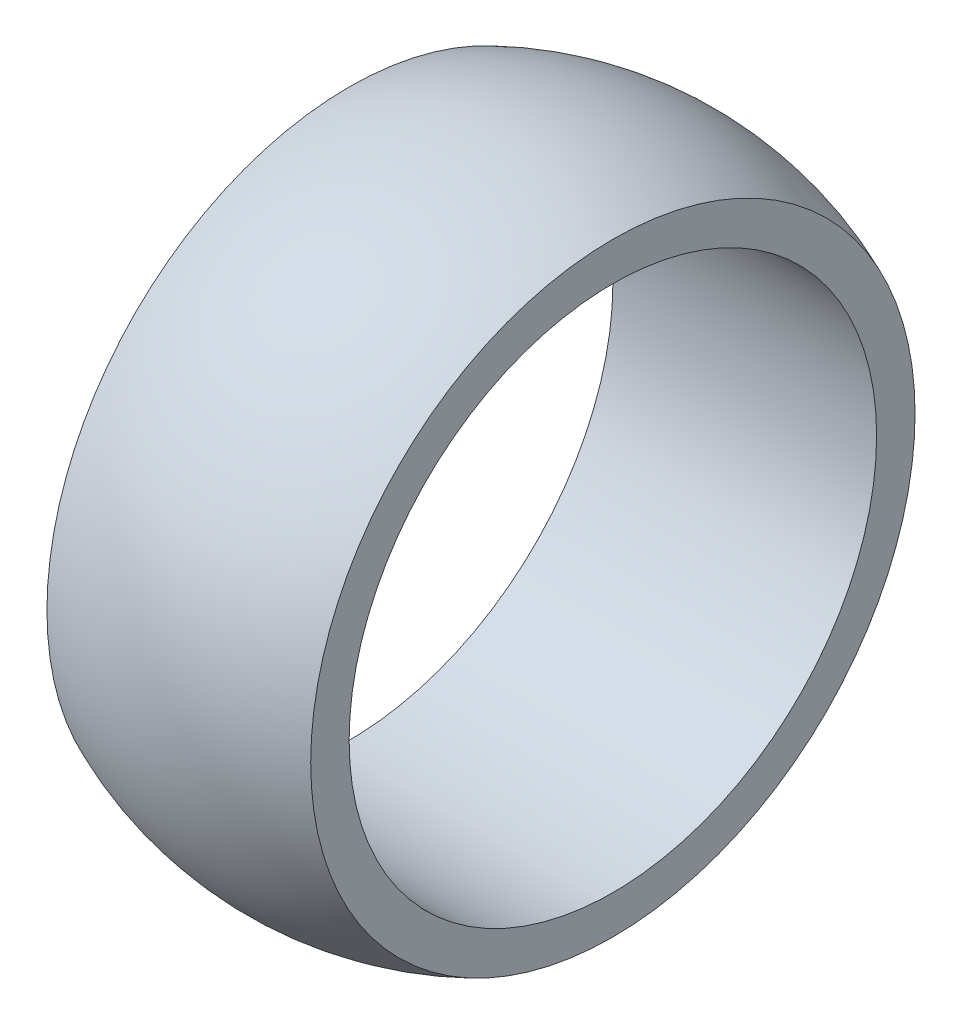
ISO-10303-21;
HEADER;
FILE_DESCRIPTION(('STEP AP214'),'2;1');
FILE_NAME('part.step','',(''),(''),'','','');
FILE_SCHEMA(('AUTOMOTIVE_DESIGN { 1 0 10303 214 1 1 1 1 }'));
ENDSEC;
DATA;
#1=APPLICATION_CONTEXT('core data for automotive mechanical design processes');
#2=APPLICATION_PROTOCOL_DEFINITION('international standard','automotive_design',2000,#1);
#3=PRODUCT_CONTEXT('',#1,'mechanical');
#4=PRODUCT('Part','Part','',(#3));
#5=PRODUCT_RELATED_PRODUCT_CATEGORY('part','',(#4));
#6=PRODUCT_DEFINITION_FORMATION('','',#4);
#7=PRODUCT_DEFINITION_CONTEXT('part definition',#1,'design');
#8=PRODUCT_DEFINITION('design','',#6,#7);
#9=PRODUCT_DEFINITION_SHAPE('','',#8);
#10=(LENGTH_UNIT() NAMED_UNIT(*) SI_UNIT(.MILLI.,.METRE.));
#11=(NAMED_UNIT(*) PLANE_ANGLE_UNIT() SI_UNIT($,.RADIAN.));
#12=(NAMED_UNIT(*) SI_UNIT($,.STERADIAN.) SOLID_ANGLE_UNIT());
#13=UNCERTAINTY_MEASURE_WITH_UNIT(LENGTH_MEASURE(1.E-05),#10,'distance_accuracy_value','');
#14=(GEOMETRIC_REPRESENTATION_CONTEXT(3) GLOBAL_UNCERTAINTY_ASSIGNED_CONTEXT((#13)) GLOBAL_UNIT_ASSIGNED_CONTEXT((#10,
#11,#12)) REPRESENTATION_CONTEXT('',''));
#15=CARTESIAN_POINT('',(0.,0.,0.));
#16=DIRECTION('',(0.,0.,1.));
#17=DIRECTION('',(1.,0.,0.));
#18=AXIS2_PLACEMENT_3D('',#15,#16,#17);
#19=CARTESIAN_POINT('',(0.,0.,0.));
#20=DIRECTION('',(0.,0.,-1.));
#21=DIRECTION('',(1.,0.,0.));
#22=AXIS2_PLACEMENT_3D('',#19,#20,#21);
#23=SPHERICAL_SURFACE('',#22,3.175);
#24=CARTESIAN_POINT('',(0.,0.,0.));
#25=DIRECTION('',(1.,0.,0.));
#26=DIRECTION('',(0.,0.,-1.));
#27=AXIS2_PLACEMENT_3D('',#24,#25,#26);
#28=SPHERICAL_SURFACE('',#27,3.175);
#29=CARTESIAN_POINT('',(1.27,0.,0.));
#30=DIRECTION('',(1.,0.,0.));
#31=DIRECTION('',(0.,0.,-1.));
#32=AXIS2_PLACEMENT_3D('',#29,#30,#31);
#33=CIRCLE('',#32,2.90993556629696);
#34=CARTESIAN_POINT('',(1.27,0.,-2.90993556629696));
#35=VERTEX_POINT('',#34);
#36=EDGE_CURVE('E10',#35,#35,#33,.F.);
#37=ORIENTED_EDGE('',*,*,#36,.T.);
#38=EDGE_LOOP('',(#37));
#39=FACE_BOUND('',#38,.T.);
#40=CARTESIAN_POINT('',(-1.27,0.,0.));
#41=DIRECTION('',(-1.,0.,0.));
#42=DIRECTION('',(0.,0.,1.));
#43=AXIS2_PLACEMENT_3D('',#40,#41,#42);
#44=CIRCLE('',#43,2.90993556629696);
#45=CARTESIAN_POINT('',(-1.27,0.,2.90993556629696));
#46=VERTEX_POINT('',#45);
#47=EDGE_CURVE('E46',#46,#46,#44,.F.);
#48=ORIENTED_EDGE('',*,*,#47,.T.);
#49=EDGE_LOOP('',(#48));
#50=FACE_BOUND('',#49,.T.);
#51=ADVANCED_FACE('F34',(#39,#50),#28,.T.);
#52=CARTESIAN_POINT('',(-3.175,0.,0.));
#53=DIRECTION('',(1.,0.,0.));
#54=DIRECTION('',(0.,0.,-1.));
#55=AXIS2_PLACEMENT_3D('',#52,#53,#54);
#56=CYLINDRICAL_SURFACE('',#55,2.54);
#57=CARTESIAN_POINT('',(1.27,0.,0.));
#58=DIRECTION('',(1.,0.,0.));
#59=DIRECTION('',(0.,0.,-1.));
#60=AXIS2_PLACEMENT_3D('',#57,#58,#59);
#61=CIRCLE('',#60,2.54);
#62=CARTESIAN_POINT('',(1.27,0.,-2.54));
#63=VERTEX_POINT('',#62);
#64=EDGE_CURVE('E41',#63,#63,#61,.F.);
#65=CARTESIAN_POINT('',(-1.27,0.,0.));
#66=DIRECTION('',(-1.,0.,0.));
#67=DIRECTION('',(0.,0.,1.));
#68=AXIS2_PLACEMENT_3D('',#65,#66,#67);
#69=CIRCLE('',#68,2.54);
#70=CARTESIAN_POINT('',(-1.27,0.,-2.54));
#71=VERTEX_POINT('',#70);
#72=EDGE_CURVE('E37',#71,#71,#69,.F.);
#73=CARTESIAN_POINT('',(1.27,0.,-2.54));
#74=CARTESIAN_POINT('',(1.24354166666667,0.,-2.54));
#75=CARTESIAN_POINT('',(1.21708333333333,0.,-2.54));
#76=CARTESIAN_POINT('',(1.16416666666667,0.,-2.54));
#77=CARTESIAN_POINT('',(1.13770833333333,0.,-2.54));
#78=CARTESIAN_POINT('',(1.08479166666667,0.,-2.54));
#79=CARTESIAN_POINT('',(1.05833333333333,0.,-2.54));
#80=CARTESIAN_POINT('',(1.00541666666667,0.,-2.54));
#81=CARTESIAN_POINT('',(0.978958333333332,0.,-2.54));
#82=CARTESIAN_POINT('',(0.926041666666665,0.,-2.54));
#83=CARTESIAN_POINT('',(0.899583333333332,0.,-2.54));
#84=CARTESIAN_POINT('',(0.846666666666666,0.,-2.54));
#85=CARTESIAN_POINT('',(0.820208333333333,0.,-2.54));
#86=CARTESIAN_POINT('',(0.767291666666666,0.,-2.54));
#87=CARTESIAN_POINT('',(0.740833333333333,0.,-2.54));
#88=CARTESIAN_POINT('',(0.687916666666666,0.,-2.54));
#89=CARTESIAN_POINT('',(0.661458333333333,0.,-2.54));
#90=CARTESIAN_POINT('',(0.608541666666666,0.,-2.54));
#91=CARTESIAN_POINT('',(0.582083333333333,0.,-2.54));
#92=CARTESIAN_POINT('',(0.529166666666666,0.,-2.54));
#93=CARTESIAN_POINT('',(0.502708333333333,0.,-2.54));
#94=CARTESIAN_POINT('',(0.449791666666666,0.,-2.54));
#95=CARTESIAN_POINT('',(0.423333333333333,0.,-2.54));
#96=CARTESIAN_POINT('',(0.370416666666666,0.,-2.54));
#97=CARTESIAN_POINT('',(0.343958333333333,0.,-2.54));
#98=CARTESIAN_POINT('',(0.291041666666666,0.,-2.54));
#99=CARTESIAN_POINT('',(0.264583333333333,0.,-2.54));
#100=CARTESIAN_POINT('',(0.211666666666666,0.,-2.54));
#101=CARTESIAN_POINT('',(0.185208333333333,0.,-2.54));
#102=CARTESIAN_POINT('',(0.132291666666666,0.,-2.54));
#103=CARTESIAN_POINT('',(0.105833333333333,0.,-2.54));
#104=CARTESIAN_POINT('',(0.0529166666666665,0.,-2.54));
#105=CARTESIAN_POINT('',(0.026458333333333,0.,-2.54));
#106=CARTESIAN_POINT('',(-0.0264583333333336,0.,-2.54));
#107=CARTESIAN_POINT('',(-0.0529166666666668,0.,-2.54));
#108=CARTESIAN_POINT('',(-0.105833333333333,0.,-2.54));
#109=CARTESIAN_POINT('',(-0.132291666666667,0.,-2.54));
#110=CARTESIAN_POINT('',(-0.185208333333333,0.,-2.54));
#111=CARTESIAN_POINT('',(-0.211666666666667,0.,-2.54));
#112=CARTESIAN_POINT('',(-0.264583333333333,0.,-2.54));
#113=CARTESIAN_POINT('',(-0.291041666666667,0.,-2.54));
#114=CARTESIAN_POINT('',(-0.343958333333333,0.,-2.54));
#115=CARTESIAN_POINT('',(-0.370416666666667,0.,-2.54));
#116=CARTESIAN_POINT('',(-0.423333333333333,0.,-2.54));
#117=CARTESIAN_POINT('',(-0.449791666666666,0.,-2.54));
#118=CARTESIAN_POINT('',(-0.502708333333333,0.,-2.54));
#119=CARTESIAN_POINT('',(-0.529166666666667,0.,-2.54));
#120=CARTESIAN_POINT('',(-0.582083333333333,0.,-2.54));
#121=CARTESIAN_POINT('',(-0.608541666666667,0.,-2.54));
#122=CARTESIAN_POINT('',(-0.661458333333333,0.,-2.54));
#123=CARTESIAN_POINT('',(-0.687916666666666,0.,-2.54));
#124=CARTESIAN_POINT('',(-0.740833333333333,0.,-2.54));
#125=CARTESIAN_POINT('',(-0.767291666666666,0.,-2.54));
#126=CARTESIAN_POINT('',(-0.820208333333333,0.,-2.54));
#127=CARTESIAN_POINT('',(-0.846666666666666,0.,-2.54));
#128=CARTESIAN_POINT('',(-0.899583333333333,0.,-2.54));
#129=CARTESIAN_POINT('',(-0.926041666666666,0.,-2.54));
#130=CARTESIAN_POINT('',(-0.978958333333333,0.,-2.54));
#131=CARTESIAN_POINT('',(-1.00541666666667,0.,-2.54));
#132=CARTESIAN_POINT('',(-1.05833333333333,0.,-2.54));
#133=CARTESIAN_POINT('',(-1.08479166666667,0.,-2.54));
#134=CARTESIAN_POINT('',(-1.13770833333333,0.,-2.54));
#135=CARTESIAN_POINT('',(-1.16416666666667,0.,-2.54));
#136=CARTESIAN_POINT('',(-1.21708333333333,0.,-2.54));
#137=CARTESIAN_POINT('',(-1.24354166666667,0.,-2.54));
#138=CARTESIAN_POINT('',(-1.27,0.,-2.54));
#139=B_SPLINE_CURVE_WITH_KNOTS('',3,(#73,#74,#75,#76,#77,#78,#79,#80,#81,#82,#83,#84,#85,#86,
#87,#88,#89,#90,#91,#92,#93,#94,#95,#96,#97,#98,#99,#100,#101,#102,#103,#104,#105,#106,#107,
#108,#109,#110,#111,#112,#113,#114,#115,#116,#117,#118,#119,#120,#121,#122,#123,#124,#125,#126,
#127,#128,#129,#130,#131,#132,#133,#134,#135,#136,#137,#138),.UNSPECIFIED.,.F.,.F.,(4,2,2,2,2,2,
2,2,2,2,2,2,2,2,2,2,2,2,2,2,2,2,2,2,2,2,2,2,2,2,2,2,4),(0.,0.0793749999999996,0.15875,0.238125,
0.3175,0.396875,0.476249999999999,0.555624999999999,0.634999999999999,0.714374999999999,
0.793749999999999,0.873124999999999,0.952499999999999,1.031875,1.11125,1.190625,1.27,1.349375,
1.42875,1.508125,1.5875,1.666875,1.74625,1.825625,1.905,1.984375,2.06375,2.143125,2.2225,
2.301875,2.38125,2.460625,2.54),.UNSPECIFIED.);
#140=EDGE_CURVE('BSEAM56',#63,#71,#139,.T.);
#141=ORIENTED_EDGE('',*,*,#64,.F.);
#142=ORIENTED_EDGE('',*,*,#72,.F.);
#143=ORIENTED_EDGE('',*,*,#140,.T.);
#144=ORIENTED_EDGE('',*,*,#140,.F.);
#145=EDGE_LOOP('',(#141,#143,#142,#144));
#146=FACE_BOUND('',#145,.T.);
#147=ADVANCED_FACE('F56',(#146),#56,.F.);
#148=CARTESIAN_POINT('',(1.27,0.,0.));
#149=DIRECTION('',(1.,0.,0.));
#150=DIRECTION('',(0.,0.,-1.));
#151=AXIS2_PLACEMENT_3D('',#148,#149,#150);
#152=PLANE('',#151);
#153=ORIENTED_EDGE('',*,*,#36,.F.);
#154=EDGE_LOOP('',(#153));
#155=FACE_BOUND('',#154,.T.);
#156=ORIENTED_EDGE('',*,*,#64,.T.);
#157=EDGE_LOOP('',(#156));
#158=FACE_BOUND('',#157,.T.);
#159=ADVANCED_FACE('F58',(#155,#158),#152,.T.);
#160=CARTESIAN_POINT('',(-1.27,0.,0.));
#161=DIRECTION('',(-1.,0.,0.));
#162=DIRECTION('',(0.,0.,-1.));
#163=AXIS2_PLACEMENT_3D('',#160,#161,#162);
#164=PLANE('',#163);
#165=ORIENTED_EDGE('',*,*,#47,.F.);
#166=EDGE_LOOP('',(#165));
#167=FACE_BOUND('',#166,.T.);
#168=ORIENTED_EDGE('',*,*,#72,.T.);
#169=EDGE_LOOP('',(#168));
#170=FACE_BOUND('',#169,.T.);
#171=ADVANCED_FACE('F54',(#167,#170),#164,.T.);
#172=CLOSED_SHELL('',(#51,#147,#159,#171));
#173=MANIFOLD_SOLID_BREP('B2',#172);
#174=ADVANCED_BREP_SHAPE_REPRESENTATION('',(#18,#173),#14);
#175=SHAPE_DEFINITION_REPRESENTATION(#9,#174);
ENDSEC;
END-ISO-10303-21;
